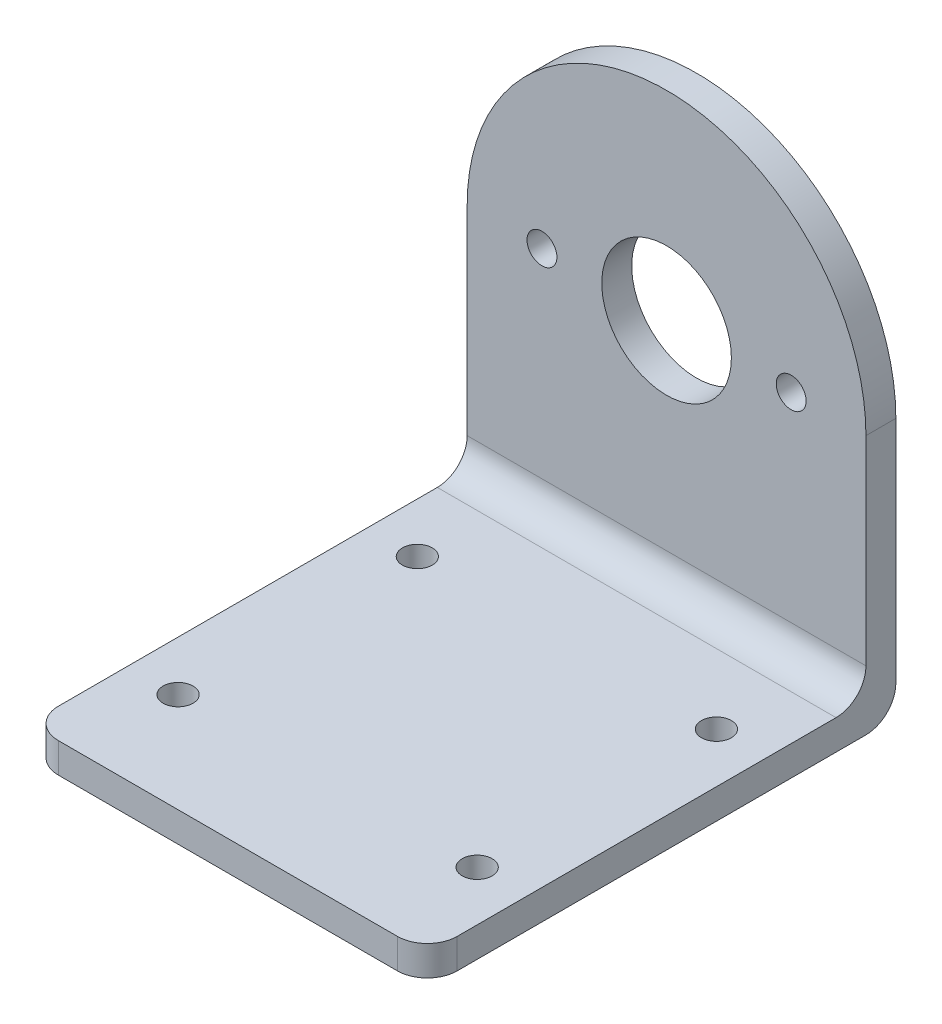
ISO-10303-21;
HEADER;
FILE_DESCRIPTION(('STEP AP214'),'2;1');
FILE_NAME('part.step','',(''),(''),'','','');
FILE_SCHEMA(('AUTOMOTIVE_DESIGN { 1 0 10303 214 1 1 1 1 }'));
ENDSEC;
DATA;
#1=APPLICATION_CONTEXT('core data for automotive mechanical design processes');
#2=APPLICATION_PROTOCOL_DEFINITION('international standard','automotive_design',2000,#1);
#3=PRODUCT_CONTEXT('',#1,'mechanical');
#4=PRODUCT('Part','Part','',(#3));
#5=PRODUCT_RELATED_PRODUCT_CATEGORY('part','',(#4));
#6=PRODUCT_DEFINITION_FORMATION('','',#4);
#7=PRODUCT_DEFINITION_CONTEXT('part definition',#1,'design');
#8=PRODUCT_DEFINITION('design','',#6,#7);
#9=PRODUCT_DEFINITION_SHAPE('','',#8);
#10=(LENGTH_UNIT() NAMED_UNIT(*) SI_UNIT(.MILLI.,.METRE.));
#11=(NAMED_UNIT(*) PLANE_ANGLE_UNIT() SI_UNIT($,.RADIAN.));
#12=(NAMED_UNIT(*) SI_UNIT($,.STERADIAN.) SOLID_ANGLE_UNIT());
#13=UNCERTAINTY_MEASURE_WITH_UNIT(LENGTH_MEASURE(1.E-05),#10,'distance_accuracy_value','');
#14=(GEOMETRIC_REPRESENTATION_CONTEXT(3) GLOBAL_UNCERTAINTY_ASSIGNED_CONTEXT((#13)) GLOBAL_UNIT_ASSIGNED_CONTEXT((#10,
#11,#12)) REPRESENTATION_CONTEXT('',''));
#15=CARTESIAN_POINT('',(0.,0.,0.));
#16=DIRECTION('',(0.,0.,1.));
#17=DIRECTION('',(1.,0.,0.));
#18=AXIS2_PLACEMENT_3D('',#15,#16,#17);
#19=CARTESIAN_POINT('',(20.,26.,3.));
#20=DIRECTION('',(0.,0.,1.));
#21=DIRECTION('',(1.,0.,0.));
#22=AXIS2_PLACEMENT_3D('',#19,#20,#21);
#23=PLANE('',#22);
#24=DIRECTION('',(0.,-1.,0.));
#25=VECTOR('',#24,1.);
#26=CARTESIAN_POINT('',(0.,0.,3.));
#27=LINE('',#26,#25);
#28=CARTESIAN_POINT('',(0.,26.,3.));
#29=VERTEX_POINT('',#28);
#30=CARTESIAN_POINT('',(0.,6.,3.));
#31=VERTEX_POINT('',#30);
#32=EDGE_CURVE('E123',#29,#31,#27,.T.);
#33=ORIENTED_EDGE('',*,*,#32,.T.);
#34=DIRECTION('',(-1.,0.,0.));
#35=VECTOR('',#34,1.);
#36=CARTESIAN_POINT('',(20.,6.,3.));
#37=LINE('',#36,#35);
#38=CARTESIAN_POINT('',(40.,6.,3.));
#39=VERTEX_POINT('',#38);
#40=EDGE_CURVE('E120',#31,#39,#37,.F.);
#41=ORIENTED_EDGE('',*,*,#40,.T.);
#42=DIRECTION('',(0.,1.,0.));
#43=VECTOR('',#42,1.);
#44=CARTESIAN_POINT('',(40.,0.,3.));
#45=LINE('',#44,#43);
#46=CARTESIAN_POINT('',(40.,26.,3.));
#47=VERTEX_POINT('',#46);
#48=EDGE_CURVE('E112',#39,#47,#45,.T.);
#49=ORIENTED_EDGE('',*,*,#48,.T.);
#50=CARTESIAN_POINT('',(20.,26.,3.));
#51=DIRECTION('',(0.,0.,1.));
#52=DIRECTION('',(1.,0.,0.));
#53=AXIS2_PLACEMENT_3D('',#50,#51,#52);
#54=CIRCLE('',#53,20.);
#55=EDGE_CURVE('E117',#47,#29,#54,.T.);
#56=ORIENTED_EDGE('',*,*,#55,.T.);
#57=EDGE_LOOP('',(#33,#41,#49,#56));
#58=FACE_BOUND('',#57,.T.);
#59=CARTESIAN_POINT('',(32.5,26.,3.));
#60=DIRECTION('',(0.,0.,1.));
#61=DIRECTION('',(1.,0.,0.));
#62=AXIS2_PLACEMENT_3D('',#59,#60,#61);
#63=CIRCLE('',#62,1.5);
#64=CARTESIAN_POINT('',(34.,26.,3.));
#65=VERTEX_POINT('',#64);
#66=EDGE_CURVE('E163',#65,#65,#63,.T.);
#67=ORIENTED_EDGE('',*,*,#66,.F.);
#68=EDGE_LOOP('',(#67));
#69=FACE_BOUND('',#68,.T.);
#70=CARTESIAN_POINT('',(20.,26.,3.));
#71=DIRECTION('',(0.,0.,1.));
#72=DIRECTION('',(1.,0.,0.));
#73=AXIS2_PLACEMENT_3D('',#70,#71,#72);
#74=CIRCLE('',#73,6.50000000000001);
#75=CARTESIAN_POINT('',(26.5,26.,3.));
#76=VERTEX_POINT('',#75);
#77=EDGE_CURVE('E147',#76,#76,#74,.T.);
#78=ORIENTED_EDGE('',*,*,#77,.F.);
#79=EDGE_LOOP('',(#78));
#80=FACE_BOUND('',#79,.T.);
#81=CARTESIAN_POINT('',(7.5,26.,3.));
#82=DIRECTION('',(0.,0.,1.));
#83=DIRECTION('',(1.,0.,0.));
#84=AXIS2_PLACEMENT_3D('',#81,#82,#83);
#85=CIRCLE('',#84,1.5);
#86=CARTESIAN_POINT('',(9.,26.,3.));
#87=VERTEX_POINT('',#86);
#88=EDGE_CURVE('E169',#87,#87,#85,.T.);
#89=ORIENTED_EDGE('',*,*,#88,.F.);
#90=EDGE_LOOP('',(#89));
#91=FACE_BOUND('',#90,.T.);
#92=ADVANCED_FACE('F36',(#58,#69,#80,#91),#23,.T.);
#93=CARTESIAN_POINT('',(20.,26.,0.));
#94=DIRECTION('',(0.,0.,1.));
#95=DIRECTION('',(1.,0.,0.));
#96=AXIS2_PLACEMENT_3D('',#93,#94,#95);
#97=PLANE('',#96);
#98=DIRECTION('',(0.,1.,0.));
#99=VECTOR('',#98,1.);
#100=CARTESIAN_POINT('',(40.,0.,0.));
#101=LINE('',#100,#99);
#102=CARTESIAN_POINT('',(40.,3.,0.));
#103=VERTEX_POINT('',#102);
#104=CARTESIAN_POINT('',(40.,26.,0.));
#105=VERTEX_POINT('',#104);
#106=EDGE_CURVE('E129',#103,#105,#101,.T.);
#107=ORIENTED_EDGE('',*,*,#106,.F.);
#108=DIRECTION('',(1.,0.,0.));
#109=VECTOR('',#108,1.);
#110=CARTESIAN_POINT('',(20.,3.,0.));
#111=LINE('',#110,#109);
#112=CARTESIAN_POINT('',(0.,3.,0.));
#113=VERTEX_POINT('',#112);
#114=EDGE_CURVE('E233',#103,#113,#111,.F.);
#115=ORIENTED_EDGE('',*,*,#114,.T.);
#116=DIRECTION('',(0.,-1.,0.));
#117=VECTOR('',#116,1.);
#118=CARTESIAN_POINT('',(0.,0.,0.));
#119=LINE('',#118,#117);
#120=CARTESIAN_POINT('',(0.,26.,0.));
#121=VERTEX_POINT('',#120);
#122=EDGE_CURVE('E144',#121,#113,#119,.T.);
#123=ORIENTED_EDGE('',*,*,#122,.F.);
#124=CARTESIAN_POINT('',(20.,26.,0.));
#125=DIRECTION('',(0.,0.,1.));
#126=DIRECTION('',(1.,0.,0.));
#127=AXIS2_PLACEMENT_3D('',#124,#125,#126);
#128=CIRCLE('',#127,20.);
#129=EDGE_CURVE('E149',#105,#121,#128,.T.);
#130=ORIENTED_EDGE('',*,*,#129,.F.);
#131=EDGE_LOOP('',(#107,#115,#123,#130));
#132=FACE_BOUND('',#131,.T.);
#133=CARTESIAN_POINT('',(20.,26.,0.));
#134=DIRECTION('',(0.,0.,1.));
#135=DIRECTION('',(1.,0.,0.));
#136=AXIS2_PLACEMENT_3D('',#133,#134,#135);
#137=CIRCLE('',#136,6.50000000000001);
#138=CARTESIAN_POINT('',(26.5,26.,0.));
#139=VERTEX_POINT('',#138);
#140=EDGE_CURVE('E160',#139,#139,#137,.T.);
#141=ORIENTED_EDGE('',*,*,#140,.T.);
#142=EDGE_LOOP('',(#141));
#143=FACE_BOUND('',#142,.T.);
#144=CARTESIAN_POINT('',(32.5,26.,0.));
#145=DIRECTION('',(0.,0.,1.));
#146=DIRECTION('',(1.,0.,0.));
#147=AXIS2_PLACEMENT_3D('',#144,#145,#146);
#148=CIRCLE('',#147,1.5);
#149=CARTESIAN_POINT('',(34.,26.,0.));
#150=VERTEX_POINT('',#149);
#151=EDGE_CURVE('E166',#150,#150,#148,.T.);
#152=ORIENTED_EDGE('',*,*,#151,.T.);
#153=EDGE_LOOP('',(#152));
#154=FACE_BOUND('',#153,.T.);
#155=CARTESIAN_POINT('',(7.5,26.,0.));
#156=DIRECTION('',(0.,0.,1.));
#157=DIRECTION('',(1.,0.,0.));
#158=AXIS2_PLACEMENT_3D('',#155,#156,#157);
#159=CIRCLE('',#158,1.5);
#160=CARTESIAN_POINT('',(9.,26.,0.));
#161=VERTEX_POINT('',#160);
#162=EDGE_CURVE('E172',#161,#161,#159,.T.);
#163=ORIENTED_EDGE('',*,*,#162,.T.);
#164=EDGE_LOOP('',(#163));
#165=FACE_BOUND('',#164,.T.);
#166=ADVANCED_FACE('F261',(#132,#143,#154,#165),#97,.F.);
#167=CARTESIAN_POINT('',(0.,0.,3.));
#168=DIRECTION('',(1.,0.,0.));
#169=DIRECTION('',(0.,0.,-1.));
#170=AXIS2_PLACEMENT_3D('',#167,#168,#169);
#171=PLANE('',#170);
#172=DIRECTION('',(0.,0.,-1.));
#173=VECTOR('',#172,1.);
#174=CARTESIAN_POINT('',(0.,0.,3.));
#175=LINE('',#174,#173);
#176=CARTESIAN_POINT('',(0.,0.,44.));
#177=VERTEX_POINT('',#176);
#178=CARTESIAN_POINT('',(0.,0.,3.));
#179=VERTEX_POINT('',#178);
#180=EDGE_CURVE('E152',#177,#179,#175,.T.);
#181=ORIENTED_EDGE('',*,*,#180,.F.);
#182=DIRECTION('',(0.,-1.,0.));
#183=VECTOR('',#182,1.);
#184=CARTESIAN_POINT('',(0.,0.,44.));
#185=LINE('',#184,#183);
#186=CARTESIAN_POINT('',(0.,3.,44.));
#187=VERTEX_POINT('',#186);
#188=EDGE_CURVE('E11',#177,#187,#185,.F.);
#189=ORIENTED_EDGE('',*,*,#188,.T.);
#190=DIRECTION('',(0.,0.,-1.));
#191=VECTOR('',#190,1.);
#192=CARTESIAN_POINT('',(0.,3.,47.));
#193=LINE('',#192,#191);
#194=CARTESIAN_POINT('',(0.,3.,6.));
#195=VERTEX_POINT('',#194);
#196=EDGE_CURVE('E181',#187,#195,#193,.T.);
#197=ORIENTED_EDGE('',*,*,#196,.T.);
#198=CARTESIAN_POINT('',(0.,6.,6.));
#199=DIRECTION('',(1.,0.,0.));
#200=DIRECTION('',(0.,0.,-1.));
#201=AXIS2_PLACEMENT_3D('',#198,#199,#200);
#202=CIRCLE('',#201,3.);
#203=EDGE_CURVE('E214',#195,#31,#202,.T.);
#204=ORIENTED_EDGE('',*,*,#203,.T.);
#205=ORIENTED_EDGE('',*,*,#32,.F.);
#206=DIRECTION('',(0.,0.,-1.));
#207=VECTOR('',#206,1.);
#208=CARTESIAN_POINT('',(0.,26.,3.));
#209=LINE('',#208,#207);
#210=EDGE_CURVE('E133',#29,#121,#209,.T.);
#211=ORIENTED_EDGE('',*,*,#210,.T.);
#212=ORIENTED_EDGE('',*,*,#122,.T.);
#213=CARTESIAN_POINT('',(0.,3.,3.));
#214=DIRECTION('',(1.,0.,0.));
#215=DIRECTION('',(0.,0.,-1.));
#216=AXIS2_PLACEMENT_3D('',#213,#214,#215);
#217=CIRCLE('',#216,3.);
#218=EDGE_CURVE('E211',#113,#179,#217,.F.);
#219=ORIENTED_EDGE('',*,*,#218,.T.);
#220=EDGE_LOOP('',(#181,#189,#197,#204,#205,#211,#212,#219));
#221=FACE_BOUND('',#220,.T.);
#222=ADVANCED_FACE('F266',(#221),#171,.F.);
#223=CARTESIAN_POINT('',(0.,0.,3.));
#224=DIRECTION('',(0.,1.,0.));
#225=DIRECTION('',(0.,0.,1.));
#226=AXIS2_PLACEMENT_3D('',#223,#224,#225);
#227=PLANE('',#226);
#228=CARTESIAN_POINT('',(35.,0.,13.));
#229=DIRECTION('',(0.,-1.,0.));
#230=DIRECTION('',(0.,0.,-1.));
#231=AXIS2_PLACEMENT_3D('',#228,#229,#230);
#232=CIRCLE('',#231,1.5);
#233=CARTESIAN_POINT('',(35.,0.,11.5));
#234=VERTEX_POINT('',#233);
#235=EDGE_CURVE('E198',#234,#234,#232,.T.);
#236=ORIENTED_EDGE('',*,*,#235,.F.);
#237=EDGE_LOOP('',(#236));
#238=FACE_BOUND('',#237,.T.);
#239=CARTESIAN_POINT('',(5.,0.,13.));
#240=DIRECTION('',(0.,-1.,0.));
#241=DIRECTION('',(0.,0.,-1.));
#242=AXIS2_PLACEMENT_3D('',#239,#240,#241);
#243=CIRCLE('',#242,1.5);
#244=CARTESIAN_POINT('',(5.,0.,11.5));
#245=VERTEX_POINT('',#244);
#246=EDGE_CURVE('E194',#245,#245,#243,.T.);
#247=ORIENTED_EDGE('',*,*,#246,.F.);
#248=EDGE_LOOP('',(#247));
#249=FACE_BOUND('',#248,.T.);
#250=CARTESIAN_POINT('',(35.,0.,37.));
#251=DIRECTION('',(0.,-1.,0.));
#252=DIRECTION('',(0.,0.,-1.));
#253=AXIS2_PLACEMENT_3D('',#250,#251,#252);
#254=CIRCLE('',#253,1.5);
#255=CARTESIAN_POINT('',(35.,0.,35.5));
#256=VERTEX_POINT('',#255);
#257=EDGE_CURVE('E190',#256,#256,#254,.T.);
#258=ORIENTED_EDGE('',*,*,#257,.F.);
#259=EDGE_LOOP('',(#258));
#260=FACE_BOUND('',#259,.T.);
#261=CARTESIAN_POINT('',(4.99999999999999,0.,37.));
#262=DIRECTION('',(0.,-1.,0.));
#263=DIRECTION('',(0.,0.,-1.));
#264=AXIS2_PLACEMENT_3D('',#261,#262,#263);
#265=CIRCLE('',#264,1.5);
#266=CARTESIAN_POINT('',(4.99999999999999,0.,35.5));
#267=VERTEX_POINT('',#266);
#268=EDGE_CURVE('E186',#267,#267,#265,.T.);
#269=ORIENTED_EDGE('',*,*,#268,.F.);
#270=EDGE_LOOP('',(#269));
#271=FACE_BOUND('',#270,.T.);
#272=DIRECTION('',(0.,0.,-1.));
#273=VECTOR('',#272,1.);
#274=CARTESIAN_POINT('',(40.,0.,3.));
#275=LINE('',#274,#273);
#276=CARTESIAN_POINT('',(40.,0.,44.));
#277=VERTEX_POINT('',#276);
#278=CARTESIAN_POINT('',(40.,0.,3.));
#279=VERTEX_POINT('',#278);
#280=EDGE_CURVE('E132',#277,#279,#275,.T.);
#281=ORIENTED_EDGE('',*,*,#280,.F.);
#282=CARTESIAN_POINT('',(37.,0.,44.));
#283=DIRECTION('',(0.,1.,0.));
#284=DIRECTION('',(0.,0.,1.));
#285=AXIS2_PLACEMENT_3D('',#282,#283,#284);
#286=CIRCLE('',#285,3.);
#287=CARTESIAN_POINT('',(37.,0.,47.));
#288=VERTEX_POINT('',#287);
#289=EDGE_CURVE('E44',#277,#288,#286,.F.);
#290=ORIENTED_EDGE('',*,*,#289,.T.);
#291=DIRECTION('',(1.,0.,0.));
#292=VECTOR('',#291,1.);
#293=CARTESIAN_POINT('',(0.,0.,47.));
#294=LINE('',#293,#292);
#295=CARTESIAN_POINT('',(3.,0.,47.));
#296=VERTEX_POINT('',#295);
#297=EDGE_CURVE('E182',#296,#288,#294,.T.);
#298=ORIENTED_EDGE('',*,*,#297,.F.);
#299=CARTESIAN_POINT('',(3.,0.,44.));
#300=DIRECTION('',(0.,1.,0.));
#301=DIRECTION('',(0.,0.,1.));
#302=AXIS2_PLACEMENT_3D('',#299,#300,#301);
#303=CIRCLE('',#302,3.);
#304=EDGE_CURVE('E51',#296,#177,#303,.F.);
#305=ORIENTED_EDGE('',*,*,#304,.T.);
#306=ORIENTED_EDGE('',*,*,#180,.T.);
#307=DIRECTION('',(1.,0.,0.));
#308=VECTOR('',#307,1.);
#309=CARTESIAN_POINT('',(0.,0.,3.));
#310=LINE('',#309,#308);
#311=EDGE_CURVE('E154',#179,#279,#310,.T.);
#312=ORIENTED_EDGE('',*,*,#311,.T.);
#313=EDGE_LOOP('',(#281,#290,#298,#305,#306,#312));
#314=FACE_BOUND('',#313,.T.);
#315=ADVANCED_FACE('F277',(#238,#249,#260,#271,#314),#227,.F.);
#316=CARTESIAN_POINT('',(40.,0.,3.));
#317=DIRECTION('',(-1.,0.,0.));
#318=DIRECTION('',(0.,0.,1.));
#319=AXIS2_PLACEMENT_3D('',#316,#317,#318);
#320=PLANE('',#319);
#321=DIRECTION('',(0.,0.,-1.));
#322=VECTOR('',#321,1.);
#323=CARTESIAN_POINT('',(40.,3.,47.));
#324=LINE('',#323,#322);
#325=CARTESIAN_POINT('',(40.,3.,44.));
#326=VERTEX_POINT('',#325);
#327=CARTESIAN_POINT('',(40.,3.,6.));
#328=VERTEX_POINT('',#327);
#329=EDGE_CURVE('E175',#326,#328,#324,.T.);
#330=ORIENTED_EDGE('',*,*,#329,.F.);
#331=DIRECTION('',(0.,1.,0.));
#332=VECTOR('',#331,1.);
#333=CARTESIAN_POINT('',(40.,0.,44.));
#334=LINE('',#333,#332);
#335=EDGE_CURVE('E59',#326,#277,#334,.F.);
#336=ORIENTED_EDGE('',*,*,#335,.T.);
#337=ORIENTED_EDGE('',*,*,#280,.T.);
#338=CARTESIAN_POINT('',(40.,3.,3.));
#339=DIRECTION('',(-1.,0.,0.));
#340=DIRECTION('',(0.,0.,1.));
#341=AXIS2_PLACEMENT_3D('',#338,#339,#340);
#342=CIRCLE('',#341,3.);
#343=EDGE_CURVE('E231',#279,#103,#342,.F.);
#344=ORIENTED_EDGE('',*,*,#343,.T.);
#345=ORIENTED_EDGE('',*,*,#106,.T.);
#346=DIRECTION('',(0.,0.,-1.));
#347=VECTOR('',#346,1.);
#348=CARTESIAN_POINT('',(40.,26.,3.));
#349=LINE('',#348,#347);
#350=EDGE_CURVE('E126',#47,#105,#349,.T.);
#351=ORIENTED_EDGE('',*,*,#350,.F.);
#352=ORIENTED_EDGE('',*,*,#48,.F.);
#353=CARTESIAN_POINT('',(40.,6.,6.));
#354=DIRECTION('',(-1.,0.,0.));
#355=DIRECTION('',(0.,0.,1.));
#356=AXIS2_PLACEMENT_3D('',#353,#354,#355);
#357=CIRCLE('',#356,3.);
#358=EDGE_CURVE('E216',#39,#328,#357,.T.);
#359=ORIENTED_EDGE('',*,*,#358,.T.);
#360=EDGE_LOOP('',(#330,#336,#337,#344,#345,#351,#352,#359));
#361=FACE_BOUND('',#360,.T.);
#362=ADVANCED_FACE('F127',(#361),#320,.F.);
#363=CARTESIAN_POINT('',(20.,26.,3.));
#364=DIRECTION('',(0.,0.,-1.));
#365=DIRECTION('',(-1.,0.,0.));
#366=AXIS2_PLACEMENT_3D('',#363,#364,#365);
#367=CYLINDRICAL_SURFACE('',#366,20.);
#368=ORIENTED_EDGE('',*,*,#129,.T.);
#369=ORIENTED_EDGE('',*,*,#210,.F.);
#370=ORIENTED_EDGE('',*,*,#55,.F.);
#371=ORIENTED_EDGE('',*,*,#350,.T.);
#372=EDGE_LOOP('',(#368,#369,#370,#371));
#373=FACE_BOUND('',#372,.T.);
#374=ADVANCED_FACE('F135',(#373),#367,.T.);
#375=CARTESIAN_POINT('',(20.,26.,3.));
#376=DIRECTION('',(0.,0.,-1.));
#377=DIRECTION('',(-1.,0.,0.));
#378=AXIS2_PLACEMENT_3D('',#375,#376,#377);
#379=CYLINDRICAL_SURFACE('',#378,6.50000000000001);
#380=ORIENTED_EDGE('',*,*,#77,.T.);
#381=EDGE_LOOP('',(#380));
#382=FACE_BOUND('',#381,.T.);
#383=ORIENTED_EDGE('',*,*,#140,.F.);
#384=EDGE_LOOP('',(#383));
#385=FACE_BOUND('',#384,.T.);
#386=ADVANCED_FACE('F270',(#382,#385),#379,.F.);
#387=CARTESIAN_POINT('',(32.5,26.,3.));
#388=DIRECTION('',(0.,0.,-1.));
#389=DIRECTION('',(-1.,0.,0.));
#390=AXIS2_PLACEMENT_3D('',#387,#388,#389);
#391=CYLINDRICAL_SURFACE('',#390,1.5);
#392=ORIENTED_EDGE('',*,*,#66,.T.);
#393=EDGE_LOOP('',(#392));
#394=FACE_BOUND('',#393,.T.);
#395=ORIENTED_EDGE('',*,*,#151,.F.);
#396=EDGE_LOOP('',(#395));
#397=FACE_BOUND('',#396,.T.);
#398=ADVANCED_FACE('F327',(#394,#397),#391,.F.);
#399=CARTESIAN_POINT('',(7.5,26.,3.));
#400=DIRECTION('',(0.,0.,-1.));
#401=DIRECTION('',(-1.,0.,0.));
#402=AXIS2_PLACEMENT_3D('',#399,#400,#401);
#403=CYLINDRICAL_SURFACE('',#402,1.5);
#404=ORIENTED_EDGE('',*,*,#88,.T.);
#405=EDGE_LOOP('',(#404));
#406=FACE_BOUND('',#405,.T.);
#407=ORIENTED_EDGE('',*,*,#162,.F.);
#408=EDGE_LOOP('',(#407));
#409=FACE_BOUND('',#408,.T.);
#410=ADVANCED_FACE('F325',(#406,#409),#403,.F.);
#411=CARTESIAN_POINT('',(0.,3.,47.));
#412=DIRECTION('',(0.,-1.,0.));
#413=DIRECTION('',(0.,0.,-1.));
#414=AXIS2_PLACEMENT_3D('',#411,#412,#413);
#415=PLANE('',#414);
#416=CARTESIAN_POINT('',(35.,3.,13.));
#417=DIRECTION('',(0.,-1.,0.));
#418=DIRECTION('',(0.,0.,-1.));
#419=AXIS2_PLACEMENT_3D('',#416,#417,#418);
#420=CIRCLE('',#419,1.5);
#421=CARTESIAN_POINT('',(35.,3.,11.5));
#422=VERTEX_POINT('',#421);
#423=EDGE_CURVE('E197',#422,#422,#420,.T.);
#424=ORIENTED_EDGE('',*,*,#423,.T.);
#425=EDGE_LOOP('',(#424));
#426=FACE_BOUND('',#425,.T.);
#427=CARTESIAN_POINT('',(5.,3.,13.));
#428=DIRECTION('',(0.,-1.,0.));
#429=DIRECTION('',(0.,0.,-1.));
#430=AXIS2_PLACEMENT_3D('',#427,#428,#429);
#431=CIRCLE('',#430,1.5);
#432=CARTESIAN_POINT('',(5.,3.,11.5));
#433=VERTEX_POINT('',#432);
#434=EDGE_CURVE('E193',#433,#433,#431,.T.);
#435=ORIENTED_EDGE('',*,*,#434,.T.);
#436=EDGE_LOOP('',(#435));
#437=FACE_BOUND('',#436,.T.);
#438=CARTESIAN_POINT('',(35.,3.,37.));
#439=DIRECTION('',(0.,-1.,0.));
#440=DIRECTION('',(0.,0.,-1.));
#441=AXIS2_PLACEMENT_3D('',#438,#439,#440);
#442=CIRCLE('',#441,1.5);
#443=CARTESIAN_POINT('',(35.,3.,35.5));
#444=VERTEX_POINT('',#443);
#445=EDGE_CURVE('E189',#444,#444,#442,.T.);
#446=ORIENTED_EDGE('',*,*,#445,.T.);
#447=EDGE_LOOP('',(#446));
#448=FACE_BOUND('',#447,.T.);
#449=CARTESIAN_POINT('',(4.99999999999999,3.,37.));
#450=DIRECTION('',(0.,-1.,0.));
#451=DIRECTION('',(0.,0.,-1.));
#452=AXIS2_PLACEMENT_3D('',#449,#450,#451);
#453=CIRCLE('',#452,1.5);
#454=CARTESIAN_POINT('',(4.99999999999999,3.,35.5));
#455=VERTEX_POINT('',#454);
#456=EDGE_CURVE('E185',#455,#455,#453,.T.);
#457=ORIENTED_EDGE('',*,*,#456,.T.);
#458=EDGE_LOOP('',(#457));
#459=FACE_BOUND('',#458,.T.);
#460=DIRECTION('',(-1.,0.,0.));
#461=VECTOR('',#460,1.);
#462=CARTESIAN_POINT('',(0.,3.,47.));
#463=LINE('',#462,#461);
#464=CARTESIAN_POINT('',(37.,3.,47.));
#465=VERTEX_POINT('',#464);
#466=CARTESIAN_POINT('',(3.,3.,47.));
#467=VERTEX_POINT('',#466);
#468=EDGE_CURVE('E178',#465,#467,#463,.T.);
#469=ORIENTED_EDGE('',*,*,#468,.F.);
#470=CARTESIAN_POINT('',(37.,3.,44.));
#471=DIRECTION('',(0.,-1.,0.));
#472=DIRECTION('',(0.,0.,-1.));
#473=AXIS2_PLACEMENT_3D('',#470,#471,#472);
#474=CIRCLE('',#473,3.);
#475=EDGE_CURVE('E303',#465,#326,#474,.F.);
#476=ORIENTED_EDGE('',*,*,#475,.T.);
#477=ORIENTED_EDGE('',*,*,#329,.T.);
#478=DIRECTION('',(-1.,0.,0.));
#479=VECTOR('',#478,1.);
#480=CARTESIAN_POINT('',(0.,3.,6.));
#481=LINE('',#480,#479);
#482=EDGE_CURVE('E209',#328,#195,#481,.T.);
#483=ORIENTED_EDGE('',*,*,#482,.T.);
#484=ORIENTED_EDGE('',*,*,#196,.F.);
#485=CARTESIAN_POINT('',(3.,3.,44.));
#486=DIRECTION('',(0.,-1.,0.));
#487=DIRECTION('',(0.,0.,-1.));
#488=AXIS2_PLACEMENT_3D('',#485,#486,#487);
#489=CIRCLE('',#488,3.);
#490=EDGE_CURVE('E224',#187,#467,#489,.F.);
#491=ORIENTED_EDGE('',*,*,#490,.T.);
#492=EDGE_LOOP('',(#469,#476,#477,#483,#484,#491));
#493=FACE_BOUND('',#492,.T.);
#494=ADVANCED_FACE('F241',(#426,#437,#448,#459,#493),#415,.F.);
#495=CARTESIAN_POINT('',(0.,0.,47.));
#496=DIRECTION('',(0.,0.,-1.));
#497=DIRECTION('',(-1.,0.,0.));
#498=AXIS2_PLACEMENT_3D('',#495,#496,#497);
#499=PLANE('',#498);
#500=ORIENTED_EDGE('',*,*,#297,.T.);
#501=DIRECTION('',(0.,1.,0.));
#502=VECTOR('',#501,1.);
#503=CARTESIAN_POINT('',(37.,0.,47.));
#504=LINE('',#503,#502);
#505=EDGE_CURVE('E221',#288,#465,#504,.T.);
#506=ORIENTED_EDGE('',*,*,#505,.T.);
#507=ORIENTED_EDGE('',*,*,#468,.T.);
#508=DIRECTION('',(0.,-1.,0.));
#509=VECTOR('',#508,1.);
#510=CARTESIAN_POINT('',(3.,0.,47.));
#511=LINE('',#510,#509);
#512=EDGE_CURVE('E218',#467,#296,#511,.T.);
#513=ORIENTED_EDGE('',*,*,#512,.T.);
#514=EDGE_LOOP('',(#500,#506,#507,#513));
#515=FACE_BOUND('',#514,.T.);
#516=ADVANCED_FACE('F286',(#515),#499,.F.);
#517=CARTESIAN_POINT('',(0.,3.,3.));
#518=DIRECTION('',(1.,0.,0.));
#519=DIRECTION('',(0.,0.,-1.));
#520=AXIS2_PLACEMENT_3D('',#517,#518,#519);
#521=CYLINDRICAL_SURFACE('',#520,3.);
#522=ORIENTED_EDGE('',*,*,#218,.F.);
#523=ORIENTED_EDGE('',*,*,#114,.F.);
#524=ORIENTED_EDGE('',*,*,#343,.F.);
#525=ORIENTED_EDGE('',*,*,#311,.F.);
#526=EDGE_LOOP('',(#522,#523,#524,#525));
#527=FACE_BOUND('',#526,.T.);
#528=ADVANCED_FACE('F257',(#527),#521,.T.);
#529=CARTESIAN_POINT('',(4.99999999999999,46.,37.));
#530=DIRECTION('',(0.,-1.,0.));
#531=DIRECTION('',(0.,0.,-1.));
#532=AXIS2_PLACEMENT_3D('',#529,#530,#531);
#533=CYLINDRICAL_SURFACE('',#532,1.5);
#534=ORIENTED_EDGE('',*,*,#268,.T.);
#535=EDGE_LOOP('',(#534));
#536=FACE_BOUND('',#535,.T.);
#537=ORIENTED_EDGE('',*,*,#456,.F.);
#538=EDGE_LOOP('',(#537));
#539=FACE_BOUND('',#538,.T.);
#540=ADVANCED_FACE('F247',(#536,#539),#533,.F.);
#541=CARTESIAN_POINT('',(35.,46.,37.));
#542=DIRECTION('',(0.,-1.,0.));
#543=DIRECTION('',(0.,0.,-1.));
#544=AXIS2_PLACEMENT_3D('',#541,#542,#543);
#545=CYLINDRICAL_SURFACE('',#544,1.5);
#546=ORIENTED_EDGE('',*,*,#257,.T.);
#547=EDGE_LOOP('',(#546));
#548=FACE_BOUND('',#547,.T.);
#549=ORIENTED_EDGE('',*,*,#445,.F.);
#550=EDGE_LOOP('',(#549));
#551=FACE_BOUND('',#550,.T.);
#552=ADVANCED_FACE('F244',(#548,#551),#545,.F.);
#553=CARTESIAN_POINT('',(5.,46.,13.));
#554=DIRECTION('',(0.,-1.,0.));
#555=DIRECTION('',(0.,0.,-1.));
#556=AXIS2_PLACEMENT_3D('',#553,#554,#555);
#557=CYLINDRICAL_SURFACE('',#556,1.5);
#558=ORIENTED_EDGE('',*,*,#246,.T.);
#559=EDGE_LOOP('',(#558));
#560=FACE_BOUND('',#559,.T.);
#561=ORIENTED_EDGE('',*,*,#434,.F.);
#562=EDGE_LOOP('',(#561));
#563=FACE_BOUND('',#562,.T.);
#564=ADVANCED_FACE('F246',(#560,#563),#557,.F.);
#565=CARTESIAN_POINT('',(35.,46.,13.));
#566=DIRECTION('',(0.,-1.,0.));
#567=DIRECTION('',(0.,0.,-1.));
#568=AXIS2_PLACEMENT_3D('',#565,#566,#567);
#569=CYLINDRICAL_SURFACE('',#568,1.5);
#570=ORIENTED_EDGE('',*,*,#235,.T.);
#571=EDGE_LOOP('',(#570));
#572=FACE_BOUND('',#571,.T.);
#573=ORIENTED_EDGE('',*,*,#423,.F.);
#574=EDGE_LOOP('',(#573));
#575=FACE_BOUND('',#574,.T.);
#576=ADVANCED_FACE('F254',(#572,#575),#569,.F.);
#577=CARTESIAN_POINT('',(0.,6.,6.));
#578=DIRECTION('',(-1.,0.,0.));
#579=DIRECTION('',(0.,0.,1.));
#580=AXIS2_PLACEMENT_3D('',#577,#578,#579);
#581=CYLINDRICAL_SURFACE('',#580,3.);
#582=ORIENTED_EDGE('',*,*,#358,.F.);
#583=ORIENTED_EDGE('',*,*,#40,.F.);
#584=ORIENTED_EDGE('',*,*,#203,.F.);
#585=ORIENTED_EDGE('',*,*,#482,.F.);
#586=EDGE_LOOP('',(#582,#583,#584,#585));
#587=FACE_BOUND('',#586,.T.);
#588=ADVANCED_FACE('F288',(#587),#581,.F.);
#589=CARTESIAN_POINT('',(37.,0.,44.));
#590=DIRECTION('',(0.,1.,0.));
#591=DIRECTION('',(0.,0.,1.));
#592=AXIS2_PLACEMENT_3D('',#589,#590,#591);
#593=CYLINDRICAL_SURFACE('',#592,3.);
#594=ORIENTED_EDGE('',*,*,#289,.F.);
#595=ORIENTED_EDGE('',*,*,#335,.F.);
#596=ORIENTED_EDGE('',*,*,#475,.F.);
#597=ORIENTED_EDGE('',*,*,#505,.F.);
#598=EDGE_LOOP('',(#594,#595,#596,#597));
#599=FACE_BOUND('',#598,.T.);
#600=ADVANCED_FACE('F290',(#599),#593,.T.);
#601=CARTESIAN_POINT('',(3.,0.,44.));
#602=DIRECTION('',(0.,-1.,0.));
#603=DIRECTION('',(0.,0.,-1.));
#604=AXIS2_PLACEMENT_3D('',#601,#602,#603);
#605=CYLINDRICAL_SURFACE('',#604,3.);
#606=ORIENTED_EDGE('',*,*,#490,.F.);
#607=ORIENTED_EDGE('',*,*,#188,.F.);
#608=ORIENTED_EDGE('',*,*,#304,.F.);
#609=ORIENTED_EDGE('',*,*,#512,.F.);
#610=EDGE_LOOP('',(#606,#607,#608,#609));
#611=FACE_BOUND('',#610,.T.);
#612=ADVANCED_FACE('F38',(#611),#605,.T.);
#613=CLOSED_SHELL('',(#92,#166,#222,#315,#362,#374,#386,#398,#410,#494,#516,#528,#540,#552,#564,
#576,#588,#600,#612));
#614=MANIFOLD_SOLID_BREP('B2',#613);
#615=ADVANCED_BREP_SHAPE_REPRESENTATION('',(#18,#614),#14);
#616=SHAPE_DEFINITION_REPRESENTATION(#9,#615);
ENDSEC;
END-ISO-10303-21;
